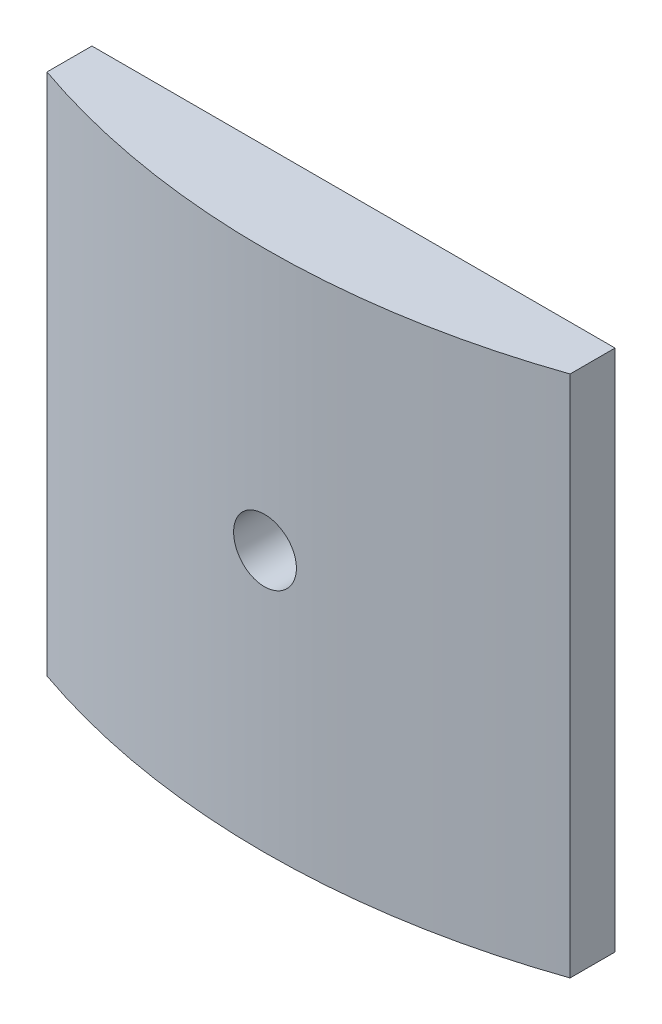
ISO-10303-21;
HEADER;
FILE_DESCRIPTION(('STEP AP214'),'2;1');
FILE_NAME('part.step','',(''),(''),'','','');
FILE_SCHEMA(('AUTOMOTIVE_DESIGN { 1 0 10303 214 1 1 1 1 }'));
ENDSEC;
DATA;
#1=APPLICATION_CONTEXT('core data for automotive mechanical design processes');
#2=APPLICATION_PROTOCOL_DEFINITION('international standard','automotive_design',2000,#1);
#3=PRODUCT_CONTEXT('',#1,'mechanical');
#4=PRODUCT('Part','Part','',(#3));
#5=PRODUCT_RELATED_PRODUCT_CATEGORY('part','',(#4));
#6=PRODUCT_DEFINITION_FORMATION('','',#4);
#7=PRODUCT_DEFINITION_CONTEXT('part definition',#1,'design');
#8=PRODUCT_DEFINITION('design','',#6,#7);
#9=PRODUCT_DEFINITION_SHAPE('','',#8);
#10=(LENGTH_UNIT() NAMED_UNIT(*) SI_UNIT(.MILLI.,.METRE.));
#11=(NAMED_UNIT(*) PLANE_ANGLE_UNIT() SI_UNIT($,.RADIAN.));
#12=(NAMED_UNIT(*) SI_UNIT($,.STERADIAN.) SOLID_ANGLE_UNIT());
#13=UNCERTAINTY_MEASURE_WITH_UNIT(LENGTH_MEASURE(1.E-05),#10,'distance_accuracy_value','');
#14=(GEOMETRIC_REPRESENTATION_CONTEXT(3) GLOBAL_UNCERTAINTY_ASSIGNED_CONTEXT((#13)) GLOBAL_UNIT_ASSIGNED_CONTEXT((#10,
#11,#12)) REPRESENTATION_CONTEXT('',''));
#15=CARTESIAN_POINT('',(0.,0.,0.));
#16=DIRECTION('',(0.,0.,1.));
#17=DIRECTION('',(1.,0.,0.));
#18=AXIS2_PLACEMENT_3D('',#15,#16,#17);
#19=CARTESIAN_POINT('',(0.,25.,33.8431677004384));
#20=DIRECTION('',(0.,0.,1.));
#21=DIRECTION('',(1.,0.,0.));
#22=AXIS2_PLACEMENT_3D('',#19,#20,#21);
#23=PLANE('',#22);
#24=CARTESIAN_POINT('',(0.,12.5,33.8431677004384));
#25=DIRECTION('',(0.,0.,-1.));
#26=DIRECTION('',(-1.,0.,0.));
#27=AXIS2_PLACEMENT_3D('',#24,#25,#26);
#28=CIRCLE('',#27,1.5);
#29=CARTESIAN_POINT('',(-1.5,12.5,33.8431677004384));
#30=VERTEX_POINT('',#29);
#31=EDGE_CURVE('E141',#30,#30,#28,.T.);
#32=ORIENTED_EDGE('',*,*,#31,.F.);
#33=EDGE_LOOP('',(#32));
#34=FACE_BOUND('',#33,.T.);
#35=DIRECTION('',(-1.,0.,0.));
#36=VECTOR('',#35,1.);
#37=CARTESIAN_POINT('',(0.,0.,33.8431677004384));
#38=LINE('',#37,#36);
#39=CARTESIAN_POINT('',(12.5,0.,33.8431677004384));
#40=VERTEX_POINT('',#39);
#41=CARTESIAN_POINT('',(-12.5,0.,33.8431677004384));
#42=VERTEX_POINT('',#41);
#43=EDGE_CURVE('E78',#40,#42,#38,.T.);
#44=ORIENTED_EDGE('',*,*,#43,.T.);
#45=DIRECTION('',(0.,-1.,0.));
#46=VECTOR('',#45,1.);
#47=CARTESIAN_POINT('',(-12.5,25.,33.8431677004384));
#48=LINE('',#47,#46);
#49=CARTESIAN_POINT('',(-12.5,25.,33.8431677004384));
#50=VERTEX_POINT('',#49);
#51=EDGE_CURVE('E11',#50,#42,#48,.T.);
#52=ORIENTED_EDGE('',*,*,#51,.F.);
#53=DIRECTION('',(1.,0.,0.));
#54=VECTOR('',#53,1.);
#55=CARTESIAN_POINT('',(0.,25.,33.8431677004384));
#56=LINE('',#55,#54);
#57=CARTESIAN_POINT('',(12.5,25.,33.8431677004384));
#58=VERTEX_POINT('',#57);
#59=EDGE_CURVE('E56',#50,#58,#56,.T.);
#60=ORIENTED_EDGE('',*,*,#59,.T.);
#61=DIRECTION('',(0.,-1.,0.));
#62=VECTOR('',#61,1.);
#63=CARTESIAN_POINT('',(12.5,25.,33.8431677004384));
#64=LINE('',#63,#62);
#65=EDGE_CURVE('E84',#58,#40,#64,.T.);
#66=ORIENTED_EDGE('',*,*,#65,.T.);
#67=EDGE_LOOP('',(#44,#52,#60,#66));
#68=FACE_BOUND('',#67,.T.);
#69=ADVANCED_FACE('F33',(#34,#68),#23,.F.);
#70=CARTESIAN_POINT('',(-12.5,25.,33.8431677004384));
#71=DIRECTION('',(1.,0.,0.));
#72=DIRECTION('',(0.,0.,-1.));
#73=AXIS2_PLACEMENT_3D('',#70,#71,#72);
#74=PLANE('',#73);
#75=DIRECTION('',(0.,0.,1.));
#76=VECTOR('',#75,1.);
#77=CARTESIAN_POINT('',(-12.5,0.,33.8431677004384));
#78=LINE('',#77,#76);
#79=CARTESIAN_POINT('',(-12.5,0.,35.9911100134464));
#80=VERTEX_POINT('',#79);
#81=EDGE_CURVE('E72',#42,#80,#78,.T.);
#82=ORIENTED_EDGE('',*,*,#81,.T.);
#83=DIRECTION('',(0.,-1.,0.));
#84=VECTOR('',#83,1.);
#85=CARTESIAN_POINT('',(-12.5,25.,35.9911100134464));
#86=LINE('',#85,#84);
#87=CARTESIAN_POINT('',(-12.5,25.,35.9911100134464));
#88=VERTEX_POINT('',#87);
#89=EDGE_CURVE('E47',#88,#80,#86,.T.);
#90=ORIENTED_EDGE('',*,*,#89,.F.);
#91=DIRECTION('',(0.,0.,1.));
#92=VECTOR('',#91,1.);
#93=CARTESIAN_POINT('',(-12.5,25.,33.8431677004384));
#94=LINE('',#93,#92);
#95=EDGE_CURVE('E92',#50,#88,#94,.T.);
#96=ORIENTED_EDGE('',*,*,#95,.F.);
#97=ORIENTED_EDGE('',*,*,#51,.T.);
#98=EDGE_LOOP('',(#82,#90,#96,#97));
#99=FACE_BOUND('',#98,.T.);
#100=ADVANCED_FACE('F125',(#99),#74,.F.);
#101=CARTESIAN_POINT('',(0.,25.,0.));
#102=DIRECTION('',(0.,-1.,0.));
#103=DIRECTION('',(0.,0.,-1.));
#104=AXIS2_PLACEMENT_3D('',#101,#102,#103);
#105=CYLINDRICAL_SURFACE('',#104,38.1);
#106=CARTESIAN_POINT('',(-1.5,12.5,38.0704609901167));
#107=CARTESIAN_POINT('',(-1.49999627598497,12.5842206205479,38.0704613879784));
#108=CARTESIAN_POINT('',(-1.49288307226542,12.6685014779409,38.0707434660156));
#109=CARTESIAN_POINT('',(-1.46460714665695,12.8347396502406,38.0718415416804));
#110=CARTESIAN_POINT('',(-1.44342773528752,12.9166940842661,38.0726581735367));
#111=CARTESIAN_POINT('',(-1.38762541450847,13.0758471329753,38.0747327080115));
#112=CARTESIAN_POINT('',(-1.35300919408498,13.1530480918688,38.0759903910401));
#113=CARTESIAN_POINT('',(-1.27132575581732,13.3005220201493,38.0788050329879));
#114=CARTESIAN_POINT('',(-1.22426153657091,13.3707966524302,38.0803619198073));
#115=CARTESIAN_POINT('',(-1.11898157337557,13.5024923614931,38.0836007641214));
#116=CARTESIAN_POINT('',(-1.06075927835396,13.563908199834,38.0852827947333));
#117=CARTESIAN_POINT('',(-0.934828318485584,13.6760985285849,38.0885816874471));
#118=CARTESIAN_POINT('',(-0.86711927223248,13.7268725909469,38.0901985469255));
#119=CARTESIAN_POINT('',(-0.724112594421639,13.816350000011,38.0931853444602));
#120=CARTESIAN_POINT('',(-0.648812644392065,13.8550496439828,38.0945552067183));
#121=CARTESIAN_POINT('',(-0.492778050831637,13.9192557978493,38.0968929399472));
#122=CARTESIAN_POINT('',(-0.412043436941658,13.9447623796928,38.0978608131103));
#123=CARTESIAN_POINT('',(-0.247476017608867,13.9818455699688,38.0992850264469));
#124=CARTESIAN_POINT('',(-0.163644855136222,13.9934294591278,38.0997416339729));
#125=CARTESIAN_POINT('',(0.00477330360212437,14.0023608923678,38.1000927479348));
#126=CARTESIAN_POINT('',(0.0893602956577042,13.9997085156984,38.0999872574997));
#127=CARTESIAN_POINT('',(0.256839696835889,13.9802487939492,38.0992262920182));
#128=CARTESIAN_POINT('',(0.339733019104022,13.9634492942571,38.0985711218013));
#129=CARTESIAN_POINT('',(0.501522032502252,13.9161843522589,38.0967849698859));
#130=CARTESIAN_POINT('',(0.580417711587048,13.8857188687786,38.0956539867537));
#131=CARTESIAN_POINT('',(0.731997155031386,13.8119777817829,38.0930431226084));
#132=CARTESIAN_POINT('',(0.804679172573717,13.7686985911728,38.0915631439203));
#133=CARTESIAN_POINT('',(0.941748995966761,13.6705612662694,38.0884210294553));
#134=CARTESIAN_POINT('',(1.00613676675778,13.6157030830342,38.0867588929084));
#135=CARTESIAN_POINT('',(1.1248361028428,13.4959206126657,38.083438393447));
#136=CARTESIAN_POINT('',(1.17914080036428,13.4309895195342,38.0817800338588));
#137=CARTESIAN_POINT('',(1.27607959439764,13.292928347751,38.0786551856191));
#138=CARTESIAN_POINT('',(1.31871368858239,13.2197982674645,38.0771886970058));
#139=CARTESIAN_POINT('',(1.39110036626044,13.0674110349324,38.0746130399749));
#140=CARTESIAN_POINT('',(1.42085271256932,12.988153769902,38.0735038781366));
#141=CARTESIAN_POINT('',(1.46662684690602,12.8257637895676,38.0717682128072));
#142=CARTESIAN_POINT('',(1.48264869905747,12.7426310923644,38.071141707062));
#143=CARTESIAN_POINT('',(1.50049858953291,12.5749098620855,38.0704424126042));
#144=CARTESIAN_POINT('',(1.50233614986198,12.490322343877,38.070369252428));
#145=CARTESIAN_POINT('',(1.49179012329278,12.3220400788509,38.0707839294851));
#146=CARTESIAN_POINT('',(1.47940656526762,12.238345330221,38.0712717655796));
#147=CARTESIAN_POINT('',(1.44077771649105,12.074251032,38.0727531067836));
#148=CARTESIAN_POINT('',(1.41453676569239,11.9938504592072,38.0737464535703));
#149=CARTESIAN_POINT('',(1.34894241124107,11.8385953284944,38.0761267101308));
#150=CARTESIAN_POINT('',(1.30958896102869,11.7637407902684,38.077513621302));
#151=CARTESIAN_POINT('',(1.21886220615819,11.6216587337076,38.0805255780326));
#152=CARTESIAN_POINT('',(1.16748249497635,11.5544353089956,38.0821507503433));
#153=CARTESIAN_POINT('',(1.05417108655094,11.4295648488201,38.0854555883713));
#154=CARTESIAN_POINT('',(0.992239345945009,11.3719178527119,38.0871352543125));
#155=CARTESIAN_POINT('',(0.859541061961472,11.2678047646551,38.0903608276211));
#156=CARTESIAN_POINT('',(0.788769696122751,11.2213448166246,38.0919066611909));
#157=CARTESIAN_POINT('',(0.640425593263375,11.1409666451289,38.0946892781688));
#158=CARTESIAN_POINT('',(0.562852877395387,11.10704838266,38.0959260625381));
#159=CARTESIAN_POINT('',(0.403131117762643,11.0527271681591,38.0979508235));
#160=CARTESIAN_POINT('',(0.3209834223969,11.032320256497,38.0987389315719));
#161=CARTESIAN_POINT('',(0.154424582066604,11.0055880451769,38.0997780305685));
#162=CARTESIAN_POINT('',(0.0700134434652778,10.9992627059356,38.100029023003));
#163=CARTESIAN_POINT('',(-0.0986149878630889,11.0008736380193,38.0999656092445));
#164=CARTESIAN_POINT('',(-0.182832373164936,11.0088002518956,38.0996515859189));
#165=CARTESIAN_POINT('',(-0.348739905619338,11.0386701695179,38.0984942636537));
#166=CARTESIAN_POINT('',(-0.430430047852011,11.0606135005491,38.0976509636838));
#167=CARTESIAN_POINT('',(-0.58896689684463,11.1178922376906,38.0955300295606));
#168=CARTESIAN_POINT('',(-0.665813536685283,11.1532278287851,38.0942523894078));
#169=CARTESIAN_POINT('',(-0.812483064574187,11.2362857876616,38.0914066230469));
#170=CARTESIAN_POINT('',(-0.882306190874678,11.2840077350757,38.0898385066975));
#171=CARTESIAN_POINT('',(-1.01299358199164,11.3905162332926,38.0865872350099));
#172=CARTESIAN_POINT('',(-1.07385271556298,11.4493090778613,38.0849040145838));
#173=CARTESIAN_POINT('',(-1.18485463661209,11.5762945341001,38.0816125205874));
#174=CARTESIAN_POINT('',(-1.23499477382803,11.6444894635869,38.0800042656289));
#175=CARTESIAN_POINT('',(-1.32314997342401,11.7883808477052,38.0770433101761));
#176=CARTESIAN_POINT('',(-1.36115562313153,11.8640830663459,38.0756908083983));
#177=CARTESIAN_POINT('',(-1.42387287857977,12.0207414886989,38.0733972772814));
#178=CARTESIAN_POINT('',(-1.44860027617793,12.1016913223626,38.0724557594085));
#179=CARTESIAN_POINT('',(-1.47753325053678,12.2359576115092,38.0713410773946));
#180=CARTESIAN_POINT('',(-1.48594761771343,12.2884032882251,38.071012487283));
#181=CARTESIAN_POINT('',(-1.49718216422382,12.3938913386397,38.0705723183565));
#182=CARTESIAN_POINT('',(-1.50000234645212,12.4469337120297,38.0704607394294));
#183=CARTESIAN_POINT('',(-1.5,12.5,38.0704609901167));
#184=B_SPLINE_CURVE_WITH_KNOTS('',3,(#106,#107,#108,#109,#110,#111,#112,#113,#114,#115,#116,
#117,#118,#119,#120,#121,#122,#123,#124,#125,#126,#127,#128,#129,#130,#131,#132,#133,#134,#135,
#136,#137,#138,#139,#140,#141,#142,#143,#144,#145,#146,#147,#148,#149,#150,#151,#152,#153,#154,
#155,#156,#157,#158,#159,#160,#161,#162,#163,#164,#165,#166,#167,#168,#169,#170,#171,#172,#173,
#174,#175,#176,#177,#178,#179,#180,#181,#182,#183),.UNSPECIFIED.,.T.,.F.,(4,2,2,2,2,2,2,2,2,2,2,
2,2,2,2,2,2,2,2,2,2,2,2,2,2,2,2,2,2,2,2,2,2,2,2,2,2,2,4),(0.,0.252468157349416,
0.505236403254023,0.7578789794852,1.01046075200108,1.26319127588212,1.51593196348454,
1.7687500803146,2.02156681837627,2.27425129096632,2.52693435692984,2.77947738790858,
3.03202117977949,3.28463573621497,3.53725136041449,3.79003841974289,4.0428255294769,
4.29561729344037,4.5484078768189,4.80102874550455,5.05364910129534,5.30619038660142,
5.55873256863787,5.81140959013729,6.06408765000938,6.31690416557076,6.56971989488327,
6.82246150130216,7.07520239726206,7.32777209476009,7.58034228391437,7.83291596189008,
8.08548106914803,8.33819019464295,8.59096173015335,8.84392886581641,9.09659447695602,
9.25567137268836,9.41474818611105),.UNSPECIFIED.);
#185=CARTESIAN_POINT('',(-1.5,12.5,38.0704609901167));
#186=VERTEX_POINT('',#185);
#187=EDGE_CURVE('E37',#186,#186,#184,.T.);
#188=ORIENTED_EDGE('',*,*,#187,.T.);
#189=EDGE_LOOP('',(#188));
#190=FACE_BOUND('',#189,.T.);
#191=CARTESIAN_POINT('',(0.,0.,0.));
#192=DIRECTION('',(0.,1.,0.));
#193=DIRECTION('',(0.,0.,1.));
#194=AXIS2_PLACEMENT_3D('',#191,#192,#193);
#195=CIRCLE('',#194,38.1);
#196=CARTESIAN_POINT('',(12.5,0.,35.9911100134464));
#197=VERTEX_POINT('',#196);
#198=EDGE_CURVE('E99',#80,#197,#195,.T.);
#199=ORIENTED_EDGE('',*,*,#198,.T.);
#200=DIRECTION('',(0.,-1.,0.));
#201=VECTOR('',#200,1.);
#202=CARTESIAN_POINT('',(12.5,25.,35.9911100134464));
#203=LINE('',#202,#201);
#204=CARTESIAN_POINT('',(12.5,25.,35.9911100134464));
#205=VERTEX_POINT('',#204);
#206=EDGE_CURVE('E96',#205,#197,#203,.T.);
#207=ORIENTED_EDGE('',*,*,#206,.F.);
#208=CARTESIAN_POINT('',(0.,25.,0.));
#209=DIRECTION('',(0.,1.,0.));
#210=DIRECTION('',(0.,0.,1.));
#211=AXIS2_PLACEMENT_3D('',#208,#209,#210);
#212=CIRCLE('',#211,38.1);
#213=EDGE_CURVE('E87',#88,#205,#212,.T.);
#214=ORIENTED_EDGE('',*,*,#213,.F.);
#215=ORIENTED_EDGE('',*,*,#89,.T.);
#216=EDGE_LOOP('',(#199,#207,#214,#215));
#217=FACE_BOUND('',#216,.T.);
#218=ADVANCED_FACE('F97',(#190,#217),#105,.T.);
#219=CARTESIAN_POINT('',(12.5,25.,33.8431677004384));
#220=DIRECTION('',(1.,0.,0.));
#221=DIRECTION('',(0.,0.,-1.));
#222=AXIS2_PLACEMENT_3D('',#219,#220,#221);
#223=PLANE('',#222);
#224=DIRECTION('',(0.,0.,1.));
#225=VECTOR('',#224,1.);
#226=CARTESIAN_POINT('',(12.5,0.,33.8431677004384));
#227=LINE('',#226,#225);
#228=EDGE_CURVE('E107',#40,#197,#227,.T.);
#229=ORIENTED_EDGE('',*,*,#228,.F.);
#230=ORIENTED_EDGE('',*,*,#65,.F.);
#231=DIRECTION('',(0.,0.,1.));
#232=VECTOR('',#231,1.);
#233=CARTESIAN_POINT('',(12.5,25.,33.8431677004384));
#234=LINE('',#233,#232);
#235=EDGE_CURVE('E90',#58,#205,#234,.T.);
#236=ORIENTED_EDGE('',*,*,#235,.T.);
#237=ORIENTED_EDGE('',*,*,#206,.T.);
#238=EDGE_LOOP('',(#229,#230,#236,#237));
#239=FACE_BOUND('',#238,.T.);
#240=ADVANCED_FACE('F35',(#239),#223,.T.);
#241=CARTESIAN_POINT('',(0.,25.,0.));
#242=DIRECTION('',(0.,1.,0.));
#243=DIRECTION('',(0.,0.,1.));
#244=AXIS2_PLACEMENT_3D('',#241,#242,#243);
#245=PLANE('',#244);
#246=ORIENTED_EDGE('',*,*,#59,.F.);
#247=ORIENTED_EDGE('',*,*,#95,.T.);
#248=ORIENTED_EDGE('',*,*,#213,.T.);
#249=ORIENTED_EDGE('',*,*,#235,.F.);
#250=EDGE_LOOP('',(#246,#247,#248,#249));
#251=FACE_BOUND('',#250,.T.);
#252=ADVANCED_FACE('F89',(#251),#245,.T.);
#253=CARTESIAN_POINT('',(0.,0.,0.));
#254=DIRECTION('',(0.,1.,0.));
#255=DIRECTION('',(0.,0.,1.));
#256=AXIS2_PLACEMENT_3D('',#253,#254,#255);
#257=PLANE('',#256);
#258=ORIENTED_EDGE('',*,*,#43,.F.);
#259=ORIENTED_EDGE('',*,*,#228,.T.);
#260=ORIENTED_EDGE('',*,*,#198,.F.);
#261=ORIENTED_EDGE('',*,*,#81,.F.);
#262=EDGE_LOOP('',(#258,#259,#260,#261));
#263=FACE_BOUND('',#262,.T.);
#264=ADVANCED_FACE('F113',(#263),#257,.F.);
#265=CARTESIAN_POINT('',(0.,12.5,53.8431677004384));
#266=DIRECTION('',(0.,0.,-1.));
#267=DIRECTION('',(-1.,0.,0.));
#268=AXIS2_PLACEMENT_3D('',#265,#266,#267);
#269=CYLINDRICAL_SURFACE('',#268,1.5);
#270=ORIENTED_EDGE('',*,*,#31,.T.);
#271=EDGE_LOOP('',(#270));
#272=FACE_BOUND('',#271,.T.);
#273=ORIENTED_EDGE('',*,*,#187,.F.);
#274=EDGE_LOOP('',(#273));
#275=FACE_BOUND('',#274,.T.);
#276=ADVANCED_FACE('F115',(#272,#275),#269,.F.);
#277=CLOSED_SHELL('',(#69,#100,#218,#240,#252,#264,#276));
#278=MANIFOLD_SOLID_BREP('B2',#277);
#279=ADVANCED_BREP_SHAPE_REPRESENTATION('',(#18,#278),#14);
#280=SHAPE_DEFINITION_REPRESENTATION(#9,#279);
ENDSEC;
END-ISO-10303-21;
